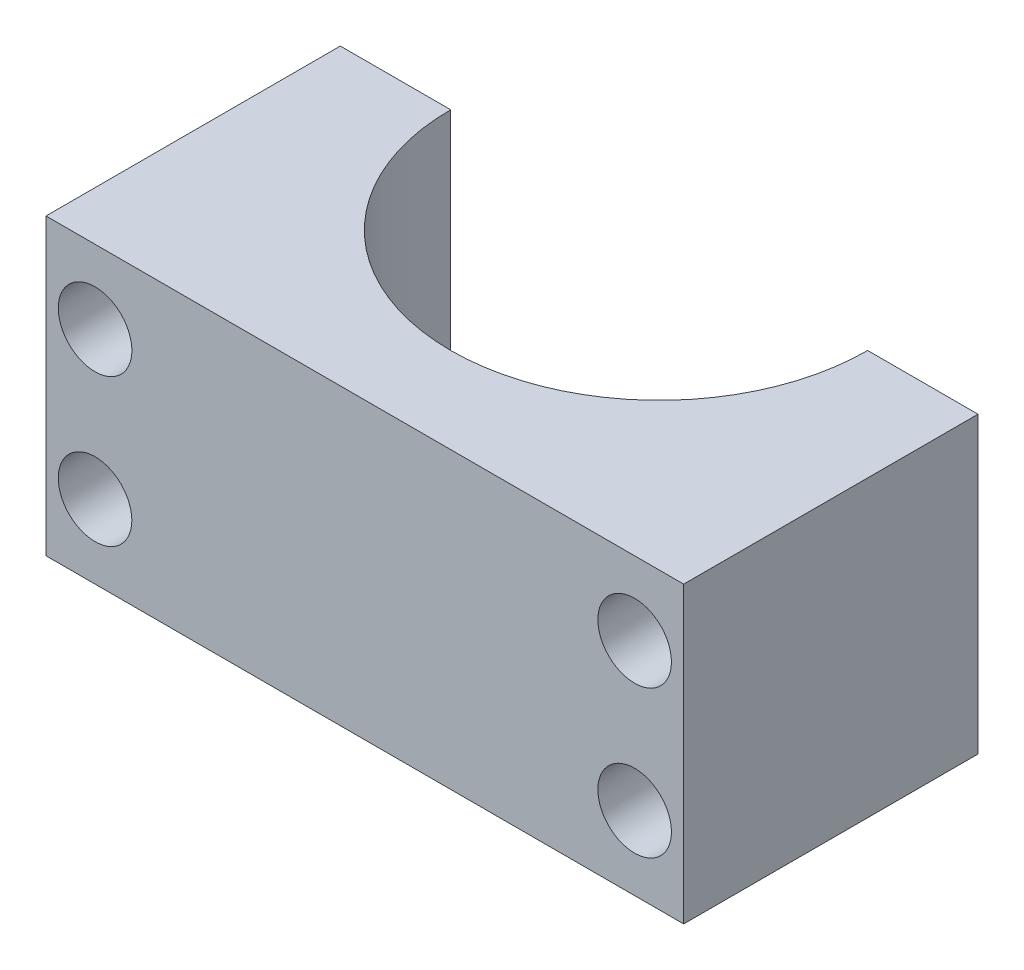
ISO-10303-21;
HEADER;
FILE_DESCRIPTION(('STEP AP214'),'2;1');
FILE_NAME('part.step','',(''),(''),'','','');
FILE_SCHEMA(('AUTOMOTIVE_DESIGN { 1 0 10303 214 1 1 1 1 }'));
ENDSEC;
DATA;
#1=APPLICATION_CONTEXT('core data for automotive mechanical design processes');
#2=APPLICATION_PROTOCOL_DEFINITION('international standard','automotive_design',2000,#1);
#3=PRODUCT_CONTEXT('',#1,'mechanical');
#4=PRODUCT('Part','Part','',(#3));
#5=PRODUCT_RELATED_PRODUCT_CATEGORY('part','',(#4));
#6=PRODUCT_DEFINITION_FORMATION('','',#4);
#7=PRODUCT_DEFINITION_CONTEXT('part definition',#1,'design');
#8=PRODUCT_DEFINITION('design','',#6,#7);
#9=PRODUCT_DEFINITION_SHAPE('','',#8);
#10=(LENGTH_UNIT() NAMED_UNIT(*) SI_UNIT(.MILLI.,.METRE.));
#11=(NAMED_UNIT(*) PLANE_ANGLE_UNIT() SI_UNIT($,.RADIAN.));
#12=(NAMED_UNIT(*) SI_UNIT($,.STERADIAN.) SOLID_ANGLE_UNIT());
#13=UNCERTAINTY_MEASURE_WITH_UNIT(LENGTH_MEASURE(1.E-05),#10,'distance_accuracy_value','');
#14=(GEOMETRIC_REPRESENTATION_CONTEXT(3) GLOBAL_UNCERTAINTY_ASSIGNED_CONTEXT((#13)) GLOBAL_UNIT_ASSIGNED_CONTEXT((#10,
#11,#12)) REPRESENTATION_CONTEXT('',''));
#15=CARTESIAN_POINT('',(0.,0.,0.));
#16=DIRECTION('',(0.,0.,1.));
#17=DIRECTION('',(1.,0.,0.));
#18=AXIS2_PLACEMENT_3D('',#15,#16,#17);
#19=CARTESIAN_POINT('',(13.,12.,0.));
#20=DIRECTION('',(-1.,0.,0.));
#21=DIRECTION('',(0.,0.,1.));
#22=AXIS2_PLACEMENT_3D('',#19,#20,#21);
#23=PLANE('',#22);
#24=DIRECTION('',(0.,0.,-1.));
#25=VECTOR('',#24,1.);
#26=CARTESIAN_POINT('',(13.,0.,0.));
#27=LINE('',#26,#25);
#28=CARTESIAN_POINT('',(13.,0.,12.));
#29=VERTEX_POINT('',#28);
#30=CARTESIAN_POINT('',(13.,0.,0.));
#31=VERTEX_POINT('',#30);
#32=EDGE_CURVE('E171',#29,#31,#27,.T.);
#33=ORIENTED_EDGE('',*,*,#32,.T.);
#34=DIRECTION('',(0.,-1.,0.));
#35=VECTOR('',#34,1.);
#36=CARTESIAN_POINT('',(13.,12.,0.));
#37=LINE('',#36,#35);
#38=CARTESIAN_POINT('',(13.,12.,0.));
#39=VERTEX_POINT('',#38);
#40=EDGE_CURVE('E12',#39,#31,#37,.T.);
#41=ORIENTED_EDGE('',*,*,#40,.F.);
#42=DIRECTION('',(0.,0.,-1.));
#43=VECTOR('',#42,1.);
#44=CARTESIAN_POINT('',(13.,12.,0.));
#45=LINE('',#44,#43);
#46=CARTESIAN_POINT('',(13.,12.,12.));
#47=VERTEX_POINT('',#46);
#48=EDGE_CURVE('E174',#47,#39,#45,.T.);
#49=ORIENTED_EDGE('',*,*,#48,.F.);
#50=DIRECTION('',(0.,-1.,0.));
#51=VECTOR('',#50,1.);
#52=CARTESIAN_POINT('',(13.,12.,12.));
#53=LINE('',#52,#51);
#54=EDGE_CURVE('E124',#47,#29,#53,.T.);
#55=ORIENTED_EDGE('',*,*,#54,.T.);
#56=EDGE_LOOP('',(#33,#41,#49,#55));
#57=FACE_BOUND('',#56,.T.);
#58=ADVANCED_FACE('F44',(#57),#23,.F.);
#59=CARTESIAN_POINT('',(8.49999999999999,12.,0.));
#60=DIRECTION('',(0.,0.,1.));
#61=DIRECTION('',(1.,0.,0.));
#62=AXIS2_PLACEMENT_3D('',#59,#60,#61);
#63=PLANE('',#62);
#64=CARTESIAN_POINT('',(11.,8.99954300649157,0.));
#65=DIRECTION('',(0.,0.,1.));
#66=DIRECTION('',(1.,0.,0.));
#67=AXIS2_PLACEMENT_3D('',#64,#65,#66);
#68=CIRCLE('',#67,1.5);
#69=CARTESIAN_POINT('',(12.5,8.99954300649157,0.));
#70=VERTEX_POINT('',#69);
#71=EDGE_CURVE('E153',#70,#70,#68,.T.);
#72=ORIENTED_EDGE('',*,*,#71,.T.);
#73=EDGE_LOOP('',(#72));
#74=FACE_BOUND('',#73,.T.);
#75=CARTESIAN_POINT('',(11.,3.00000000000007,0.));
#76=DIRECTION('',(0.,0.,1.));
#77=DIRECTION('',(-1.,0.,0.));
#78=AXIS2_PLACEMENT_3D('',#75,#76,#77);
#79=CIRCLE('',#78,1.5);
#80=CARTESIAN_POINT('',(9.50000000000001,3.00000000000007,0.));
#81=VERTEX_POINT('',#80);
#82=EDGE_CURVE('E161',#81,#81,#79,.T.);
#83=ORIENTED_EDGE('',*,*,#82,.T.);
#84=EDGE_LOOP('',(#83));
#85=FACE_BOUND('',#84,.T.);
#86=DIRECTION('',(-1.,0.,0.));
#87=VECTOR('',#86,1.);
#88=CARTESIAN_POINT('',(8.49999999999999,0.,0.));
#89=LINE('',#88,#87);
#90=CARTESIAN_POINT('',(8.49999999999999,0.,0.));
#91=VERTEX_POINT('',#90);
#92=EDGE_CURVE('E181',#31,#91,#89,.T.);
#93=ORIENTED_EDGE('',*,*,#92,.T.);
#94=DIRECTION('',(0.,-1.,0.));
#95=VECTOR('',#94,1.);
#96=CARTESIAN_POINT('',(8.49999999999999,12.,0.));
#97=LINE('',#96,#95);
#98=CARTESIAN_POINT('',(8.49999999999999,12.,0.));
#99=VERTEX_POINT('',#98);
#100=EDGE_CURVE('E52',#99,#91,#97,.T.);
#101=ORIENTED_EDGE('',*,*,#100,.F.);
#102=DIRECTION('',(-1.,0.,0.));
#103=VECTOR('',#102,1.);
#104=CARTESIAN_POINT('',(8.49999999999999,12.,0.));
#105=LINE('',#104,#103);
#106=EDGE_CURVE('E97',#39,#99,#105,.T.);
#107=ORIENTED_EDGE('',*,*,#106,.F.);
#108=ORIENTED_EDGE('',*,*,#40,.T.);
#109=EDGE_LOOP('',(#93,#101,#107,#108));
#110=FACE_BOUND('',#109,.T.);
#111=ADVANCED_FACE('F180',(#74,#85,#110),#63,.F.);
#112=CARTESIAN_POINT('',(0.,12.,0.));
#113=DIRECTION('',(0.,-1.,0.));
#114=DIRECTION('',(0.,0.,-1.));
#115=AXIS2_PLACEMENT_3D('',#112,#113,#114);
#116=CYLINDRICAL_SURFACE('',#115,8.5);
#117=CARTESIAN_POINT('',(0.,0.,0.));
#118=DIRECTION('',(0.,-1.,0.));
#119=DIRECTION('',(0.,0.,1.));
#120=AXIS2_PLACEMENT_3D('',#117,#118,#119);
#121=CIRCLE('',#120,8.5);
#122=CARTESIAN_POINT('',(-8.50000000000002,0.,0.));
#123=VERTEX_POINT('',#122);
#124=EDGE_CURVE('E185',#91,#123,#121,.T.);
#125=ORIENTED_EDGE('',*,*,#124,.T.);
#126=DIRECTION('',(0.,-1.,0.));
#127=VECTOR('',#126,1.);
#128=CARTESIAN_POINT('',(-8.50000000000002,12.,0.));
#129=LINE('',#128,#127);
#130=CARTESIAN_POINT('',(-8.50000000000002,12.,0.));
#131=VERTEX_POINT('',#130);
#132=EDGE_CURVE('E119',#131,#123,#129,.T.);
#133=ORIENTED_EDGE('',*,*,#132,.F.);
#134=CARTESIAN_POINT('',(0.,12.,0.));
#135=DIRECTION('',(0.,-1.,0.));
#136=DIRECTION('',(0.,0.,1.));
#137=AXIS2_PLACEMENT_3D('',#134,#135,#136);
#138=CIRCLE('',#137,8.5);
#139=EDGE_CURVE('E110',#99,#131,#138,.T.);
#140=ORIENTED_EDGE('',*,*,#139,.F.);
#141=ORIENTED_EDGE('',*,*,#100,.T.);
#142=EDGE_LOOP('',(#125,#133,#140,#141));
#143=FACE_BOUND('',#142,.T.);
#144=ADVANCED_FACE('F184',(#143),#116,.F.);
#145=CARTESIAN_POINT('',(-13.,12.,0.));
#146=DIRECTION('',(0.,0.,1.));
#147=DIRECTION('',(1.,0.,0.));
#148=AXIS2_PLACEMENT_3D('',#145,#146,#147);
#149=PLANE('',#148);
#150=CARTESIAN_POINT('',(-11.,8.99954300649165,0.));
#151=DIRECTION('',(0.,0.,1.));
#152=DIRECTION('',(-1.,0.,0.));
#153=AXIS2_PLACEMENT_3D('',#150,#151,#152);
#154=CIRCLE('',#153,1.5);
#155=CARTESIAN_POINT('',(-12.5,8.99954300649165,0.));
#156=VERTEX_POINT('',#155);
#157=EDGE_CURVE('E142',#156,#156,#154,.T.);
#158=ORIENTED_EDGE('',*,*,#157,.T.);
#159=EDGE_LOOP('',(#158));
#160=FACE_BOUND('',#159,.T.);
#161=CARTESIAN_POINT('',(-11.,3.,0.));
#162=DIRECTION('',(0.,0.,1.));
#163=DIRECTION('',(1.,0.,0.));
#164=AXIS2_PLACEMENT_3D('',#161,#162,#163);
#165=CIRCLE('',#164,1.5);
#166=CARTESIAN_POINT('',(-9.50000000000003,3.,0.));
#167=VERTEX_POINT('',#166);
#168=EDGE_CURVE('E143',#167,#167,#165,.T.);
#169=ORIENTED_EDGE('',*,*,#168,.T.);
#170=EDGE_LOOP('',(#169));
#171=FACE_BOUND('',#170,.T.);
#172=DIRECTION('',(-1.,0.,0.));
#173=VECTOR('',#172,1.);
#174=CARTESIAN_POINT('',(-13.,0.,0.));
#175=LINE('',#174,#173);
#176=CARTESIAN_POINT('',(-13.,0.,0.));
#177=VERTEX_POINT('',#176);
#178=EDGE_CURVE('E118',#123,#177,#175,.T.);
#179=ORIENTED_EDGE('',*,*,#178,.T.);
#180=DIRECTION('',(0.,-1.,0.));
#181=VECTOR('',#180,1.);
#182=CARTESIAN_POINT('',(-13.,12.,0.));
#183=LINE('',#182,#181);
#184=CARTESIAN_POINT('',(-13.,12.,0.));
#185=VERTEX_POINT('',#184);
#186=EDGE_CURVE('E115',#185,#177,#183,.T.);
#187=ORIENTED_EDGE('',*,*,#186,.F.);
#188=DIRECTION('',(-1.,0.,0.));
#189=VECTOR('',#188,1.);
#190=CARTESIAN_POINT('',(-13.,12.,0.));
#191=LINE('',#190,#189);
#192=EDGE_CURVE('E104',#131,#185,#191,.T.);
#193=ORIENTED_EDGE('',*,*,#192,.F.);
#194=ORIENTED_EDGE('',*,*,#132,.T.);
#195=EDGE_LOOP('',(#179,#187,#193,#194));
#196=FACE_BOUND('',#195,.T.);
#197=ADVANCED_FACE('F116',(#160,#171,#196),#149,.F.);
#198=CARTESIAN_POINT('',(-13.,12.,0.));
#199=DIRECTION('',(1.,0.,0.));
#200=DIRECTION('',(0.,0.,-1.));
#201=AXIS2_PLACEMENT_3D('',#198,#199,#200);
#202=PLANE('',#201);
#203=DIRECTION('',(0.,0.,1.));
#204=VECTOR('',#203,1.);
#205=CARTESIAN_POINT('',(-13.,0.,0.));
#206=LINE('',#205,#204);
#207=CARTESIAN_POINT('',(-13.,0.,12.));
#208=VERTEX_POINT('',#207);
#209=EDGE_CURVE('E83',#177,#208,#206,.T.);
#210=ORIENTED_EDGE('',*,*,#209,.T.);
#211=DIRECTION('',(0.,-1.,0.));
#212=VECTOR('',#211,1.);
#213=CARTESIAN_POINT('',(-13.,12.,12.));
#214=LINE('',#213,#212);
#215=CARTESIAN_POINT('',(-13.,12.,12.));
#216=VERTEX_POINT('',#215);
#217=EDGE_CURVE('E120',#216,#208,#214,.T.);
#218=ORIENTED_EDGE('',*,*,#217,.F.);
#219=DIRECTION('',(0.,0.,1.));
#220=VECTOR('',#219,1.);
#221=CARTESIAN_POINT('',(-13.,12.,0.));
#222=LINE('',#221,#220);
#223=EDGE_CURVE('E108',#185,#216,#222,.T.);
#224=ORIENTED_EDGE('',*,*,#223,.F.);
#225=ORIENTED_EDGE('',*,*,#186,.T.);
#226=EDGE_LOOP('',(#210,#218,#224,#225));
#227=FACE_BOUND('',#226,.T.);
#228=ADVANCED_FACE('F122',(#227),#202,.F.);
#229=CARTESIAN_POINT('',(-13.,12.,12.));
#230=DIRECTION('',(0.,0.,-1.));
#231=DIRECTION('',(-1.,0.,0.));
#232=AXIS2_PLACEMENT_3D('',#229,#230,#231);
#233=PLANE('',#232);
#234=CARTESIAN_POINT('',(-11.,8.99954300649165,12.));
#235=DIRECTION('',(0.,0.,1.));
#236=DIRECTION('',(-1.,0.,0.));
#237=AXIS2_PLACEMENT_3D('',#234,#235,#236);
#238=CIRCLE('',#237,1.5);
#239=CARTESIAN_POINT('',(-12.5,8.99954300649165,12.));
#240=VERTEX_POINT('',#239);
#241=EDGE_CURVE('E137',#240,#240,#238,.T.);
#242=ORIENTED_EDGE('',*,*,#241,.F.);
#243=EDGE_LOOP('',(#242));
#244=FACE_BOUND('',#243,.T.);
#245=CARTESIAN_POINT('',(11.,8.99954300649157,12.));
#246=DIRECTION('',(0.,0.,1.));
#247=DIRECTION('',(1.,0.,0.));
#248=AXIS2_PLACEMENT_3D('',#245,#246,#247);
#249=CIRCLE('',#248,1.5);
#250=CARTESIAN_POINT('',(12.5,8.99954300649157,12.));
#251=VERTEX_POINT('',#250);
#252=EDGE_CURVE('E149',#251,#251,#249,.T.);
#253=ORIENTED_EDGE('',*,*,#252,.F.);
#254=EDGE_LOOP('',(#253));
#255=FACE_BOUND('',#254,.T.);
#256=CARTESIAN_POINT('',(11.,3.00000000000007,12.));
#257=DIRECTION('',(0.,0.,1.));
#258=DIRECTION('',(-1.,0.,0.));
#259=AXIS2_PLACEMENT_3D('',#256,#257,#258);
#260=CIRCLE('',#259,1.5);
#261=CARTESIAN_POINT('',(9.50000000000001,3.00000000000007,12.));
#262=VERTEX_POINT('',#261);
#263=EDGE_CURVE('E157',#262,#262,#260,.T.);
#264=ORIENTED_EDGE('',*,*,#263,.F.);
#265=EDGE_LOOP('',(#264));
#266=FACE_BOUND('',#265,.T.);
#267=CARTESIAN_POINT('',(-11.,3.,12.));
#268=DIRECTION('',(0.,0.,1.));
#269=DIRECTION('',(1.,0.,0.));
#270=AXIS2_PLACEMENT_3D('',#267,#268,#269);
#271=CIRCLE('',#270,1.5);
#272=CARTESIAN_POINT('',(-9.50000000000002,3.,12.));
#273=VERTEX_POINT('',#272);
#274=EDGE_CURVE('E164',#273,#273,#271,.T.);
#275=ORIENTED_EDGE('',*,*,#274,.F.);
#276=EDGE_LOOP('',(#275));
#277=FACE_BOUND('',#276,.T.);
#278=DIRECTION('',(1.,0.,0.));
#279=VECTOR('',#278,1.);
#280=CARTESIAN_POINT('',(-13.,0.,12.));
#281=LINE('',#280,#279);
#282=EDGE_CURVE('E89',#208,#29,#281,.T.);
#283=ORIENTED_EDGE('',*,*,#282,.T.);
#284=ORIENTED_EDGE('',*,*,#54,.F.);
#285=DIRECTION('',(1.,0.,0.));
#286=VECTOR('',#285,1.);
#287=CARTESIAN_POINT('',(-13.,12.,12.));
#288=LINE('',#287,#286);
#289=EDGE_CURVE('E60',#216,#47,#288,.T.);
#290=ORIENTED_EDGE('',*,*,#289,.F.);
#291=ORIENTED_EDGE('',*,*,#217,.T.);
#292=EDGE_LOOP('',(#283,#284,#290,#291));
#293=FACE_BOUND('',#292,.T.);
#294=ADVANCED_FACE('F210',(#244,#255,#266,#277,#293),#233,.F.);
#295=CARTESIAN_POINT('',(0.,12.,0.));
#296=DIRECTION('',(0.,1.,0.));
#297=DIRECTION('',(0.,0.,1.));
#298=AXIS2_PLACEMENT_3D('',#295,#296,#297);
#299=PLANE('',#298);
#300=ORIENTED_EDGE('',*,*,#48,.T.);
#301=ORIENTED_EDGE('',*,*,#106,.T.);
#302=ORIENTED_EDGE('',*,*,#139,.T.);
#303=ORIENTED_EDGE('',*,*,#192,.T.);
#304=ORIENTED_EDGE('',*,*,#223,.T.);
#305=ORIENTED_EDGE('',*,*,#289,.T.);
#306=EDGE_LOOP('',(#300,#301,#302,#303,#304,#305));
#307=FACE_BOUND('',#306,.T.);
#308=ADVANCED_FACE('F106',(#307),#299,.T.);
#309=CARTESIAN_POINT('',(0.,0.,0.));
#310=DIRECTION('',(0.,1.,0.));
#311=DIRECTION('',(0.,0.,1.));
#312=AXIS2_PLACEMENT_3D('',#309,#310,#311);
#313=PLANE('',#312);
#314=ORIENTED_EDGE('',*,*,#32,.F.);
#315=ORIENTED_EDGE('',*,*,#282,.F.);
#316=ORIENTED_EDGE('',*,*,#209,.F.);
#317=ORIENTED_EDGE('',*,*,#178,.F.);
#318=ORIENTED_EDGE('',*,*,#124,.F.);
#319=ORIENTED_EDGE('',*,*,#92,.F.);
#320=EDGE_LOOP('',(#314,#315,#316,#317,#318,#319));
#321=FACE_BOUND('',#320,.T.);
#322=ADVANCED_FACE('F199',(#321),#313,.F.);
#323=CARTESIAN_POINT('',(-11.,3.,0.));
#324=DIRECTION('',(0.,0.,1.));
#325=DIRECTION('',(1.,0.,0.));
#326=AXIS2_PLACEMENT_3D('',#323,#324,#325);
#327=CYLINDRICAL_SURFACE('',#326,1.5);
#328=ORIENTED_EDGE('',*,*,#168,.F.);
#329=EDGE_LOOP('',(#328));
#330=FACE_BOUND('',#329,.T.);
#331=ORIENTED_EDGE('',*,*,#274,.T.);
#332=EDGE_LOOP('',(#331));
#333=FACE_BOUND('',#332,.T.);
#334=ADVANCED_FACE('F201',(#330,#333),#327,.F.);
#335=CARTESIAN_POINT('',(11.,3.00000000000007,0.));
#336=DIRECTION('',(0.,0.,1.));
#337=DIRECTION('',(1.,0.,0.));
#338=AXIS2_PLACEMENT_3D('',#335,#336,#337);
#339=CYLINDRICAL_SURFACE('',#338,1.5);
#340=ORIENTED_EDGE('',*,*,#82,.F.);
#341=EDGE_LOOP('',(#340));
#342=FACE_BOUND('',#341,.T.);
#343=ORIENTED_EDGE('',*,*,#263,.T.);
#344=EDGE_LOOP('',(#343));
#345=FACE_BOUND('',#344,.T.);
#346=ADVANCED_FACE('F207',(#342,#345),#339,.F.);
#347=CARTESIAN_POINT('',(11.,8.99954300649157,0.));
#348=DIRECTION('',(0.,0.,1.));
#349=DIRECTION('',(1.,0.,0.));
#350=AXIS2_PLACEMENT_3D('',#347,#348,#349);
#351=CYLINDRICAL_SURFACE('',#350,1.5);
#352=ORIENTED_EDGE('',*,*,#71,.F.);
#353=EDGE_LOOP('',(#352));
#354=FACE_BOUND('',#353,.T.);
#355=ORIENTED_EDGE('',*,*,#252,.T.);
#356=EDGE_LOOP('',(#355));
#357=FACE_BOUND('',#356,.T.);
#358=ADVANCED_FACE('F239',(#354,#357),#351,.F.);
#359=CARTESIAN_POINT('',(-11.,8.99954300649165,0.));
#360=DIRECTION('',(0.,0.,1.));
#361=DIRECTION('',(1.,0.,0.));
#362=AXIS2_PLACEMENT_3D('',#359,#360,#361);
#363=CYLINDRICAL_SURFACE('',#362,1.5);
#364=ORIENTED_EDGE('',*,*,#157,.F.);
#365=EDGE_LOOP('',(#364));
#366=FACE_BOUND('',#365,.T.);
#367=ORIENTED_EDGE('',*,*,#241,.T.);
#368=EDGE_LOOP('',(#367));
#369=FACE_BOUND('',#368,.T.);
#370=ADVANCED_FACE('F245',(#366,#369),#363,.F.);
#371=CLOSED_SHELL('',(#58,#111,#144,#197,#228,#294,#308,#322,#334,#346,#358,#370));
#372=MANIFOLD_SOLID_BREP('B2',#371);
#373=ADVANCED_BREP_SHAPE_REPRESENTATION('',(#18,#372),#14);
#374=SHAPE_DEFINITION_REPRESENTATION(#9,#373);
ENDSEC;
END-ISO-10303-21;
